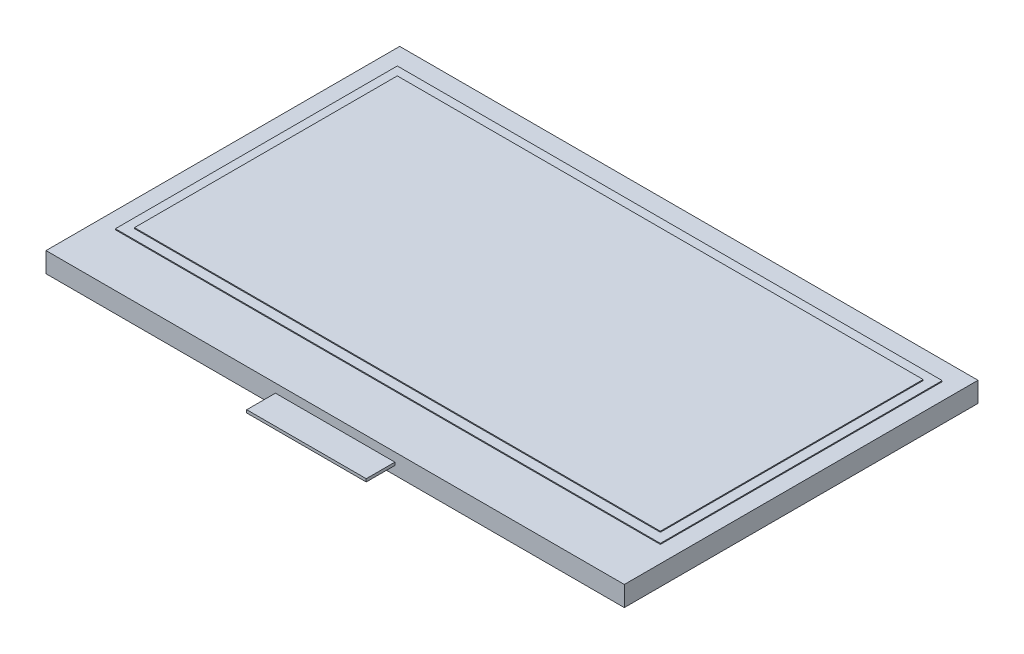
ISO-10303-21;
HEADER;
FILE_DESCRIPTION(('STEP AP214'),'2;1');
FILE_NAME('part.step','',(''),(''),'','','');
FILE_SCHEMA(('AUTOMOTIVE_DESIGN { 1 0 10303 214 1 1 1 1 }'));
ENDSEC;
DATA;
#1=APPLICATION_CONTEXT('core data for automotive mechanical design processes');
#2=APPLICATION_PROTOCOL_DEFINITION('international standard','automotive_design',2000,#1);
#3=PRODUCT_CONTEXT('',#1,'mechanical');
#4=PRODUCT('Part','Part','',(#3));
#5=PRODUCT_RELATED_PRODUCT_CATEGORY('part','',(#4));
#6=PRODUCT_DEFINITION_FORMATION('','',#4);
#7=PRODUCT_DEFINITION_CONTEXT('part definition',#1,'design');
#8=PRODUCT_DEFINITION('design','',#6,#7);
#9=PRODUCT_DEFINITION_SHAPE('','',#8);
#10=(LENGTH_UNIT() NAMED_UNIT(*) SI_UNIT(.MILLI.,.METRE.));
#11=(NAMED_UNIT(*) PLANE_ANGLE_UNIT() SI_UNIT($,.RADIAN.));
#12=(NAMED_UNIT(*) SI_UNIT($,.STERADIAN.) SOLID_ANGLE_UNIT());
#13=UNCERTAINTY_MEASURE_WITH_UNIT(LENGTH_MEASURE(1.E-05),#10,'distance_accuracy_value','');
#14=(GEOMETRIC_REPRESENTATION_CONTEXT(3) GLOBAL_UNCERTAINTY_ASSIGNED_CONTEXT((#13)) GLOBAL_UNIT_ASSIGNED_CONTEXT((#10,
#11,#12)) REPRESENTATION_CONTEXT('',''));
#15=CARTESIAN_POINT('',(0.,0.,0.));
#16=DIRECTION('',(0.,0.,1.));
#17=DIRECTION('',(1.,0.,0.));
#18=AXIS2_PLACEMENT_3D('',#15,#16,#17);
#19=CARTESIAN_POINT('',(30.25,2.1,18.5));
#20=DIRECTION('',(0.,0.,-1.));
#21=DIRECTION('',(-1.,0.,0.));
#22=AXIS2_PLACEMENT_3D('',#19,#20,#21);
#23=PLANE('',#22);
#24=DIRECTION('',(1.,0.,0.));
#25=VECTOR('',#24,1.);
#26=CARTESIAN_POINT('',(30.25,0.,18.5));
#27=LINE('',#26,#25);
#28=CARTESIAN_POINT('',(-30.25,0.,18.5));
#29=VERTEX_POINT('',#28);
#30=CARTESIAN_POINT('',(30.25,0.,18.5));
#31=VERTEX_POINT('',#30);
#32=EDGE_CURVE('E246',#29,#31,#27,.T.);
#33=ORIENTED_EDGE('',*,*,#32,.T.);
#34=DIRECTION('',(0.,-1.,0.));
#35=VECTOR('',#34,1.);
#36=CARTESIAN_POINT('',(30.25,2.1,18.5));
#37=LINE('',#36,#35);
#38=CARTESIAN_POINT('',(30.25,2.1,18.5));
#39=VERTEX_POINT('',#38);
#40=EDGE_CURVE('E43',#39,#31,#37,.T.);
#41=ORIENTED_EDGE('',*,*,#40,.F.);
#42=DIRECTION('',(1.,0.,0.));
#43=VECTOR('',#42,1.);
#44=CARTESIAN_POINT('',(30.25,2.1,18.5));
#45=LINE('',#44,#43);
#46=CARTESIAN_POINT('',(-30.25,2.1,18.5));
#47=VERTEX_POINT('',#46);
#48=EDGE_CURVE('E236',#47,#39,#45,.T.);
#49=ORIENTED_EDGE('',*,*,#48,.F.);
#50=DIRECTION('',(0.,-1.,0.));
#51=VECTOR('',#50,1.);
#52=CARTESIAN_POINT('',(-30.25,2.1,18.5));
#53=LINE('',#52,#51);
#54=EDGE_CURVE('E11',#47,#29,#53,.T.);
#55=ORIENTED_EDGE('',*,*,#54,.T.);
#56=EDGE_LOOP('',(#33,#41,#49,#55));
#57=FACE_BOUND('',#56,.T.);
#58=DIRECTION('',(0.,-1.,0.));
#59=VECTOR('',#58,1.);
#60=CARTESIAN_POINT('',(-6.25000000000002,1.18186060075837,18.5));
#61=LINE('',#60,#59);
#62=CARTESIAN_POINT('',(-6.25000000000002,1.18186060075837,18.5));
#63=VERTEX_POINT('',#62);
#64=CARTESIAN_POINT('',(-6.25000000000002,0.881860600758366,18.5));
#65=VERTEX_POINT('',#64);
#66=EDGE_CURVE('E168',#63,#65,#61,.T.);
#67=ORIENTED_EDGE('',*,*,#66,.F.);
#68=DIRECTION('',(-1.,0.,0.));
#69=VECTOR('',#68,1.);
#70=CARTESIAN_POINT('',(-6.25000000000002,1.18186060075837,18.5));
#71=LINE('',#70,#69);
#72=CARTESIAN_POINT('',(6.24999999999998,1.18186060075837,18.5));
#73=VERTEX_POINT('',#72);
#74=EDGE_CURVE('E165',#73,#63,#71,.T.);
#75=ORIENTED_EDGE('',*,*,#74,.F.);
#76=DIRECTION('',(0.,1.,0.));
#77=VECTOR('',#76,1.);
#78=CARTESIAN_POINT('',(6.24999999999998,1.18186060075837,18.5));
#79=LINE('',#78,#77);
#80=CARTESIAN_POINT('',(6.24999999999998,0.881860600758365,18.5));
#81=VERTEX_POINT('',#80);
#82=EDGE_CURVE('E55',#81,#73,#79,.T.);
#83=ORIENTED_EDGE('',*,*,#82,.F.);
#84=DIRECTION('',(1.,0.,0.));
#85=VECTOR('',#84,1.);
#86=CARTESIAN_POINT('',(-6.25000000000002,0.881860600758366,18.5));
#87=LINE('',#86,#85);
#88=EDGE_CURVE('E50',#65,#81,#87,.T.);
#89=ORIENTED_EDGE('',*,*,#88,.F.);
#90=EDGE_LOOP('',(#67,#75,#83,#89));
#91=FACE_BOUND('',#90,.T.);
#92=ADVANCED_FACE('F35',(#57,#91),#23,.F.);
#93=CARTESIAN_POINT('',(0.,2.2,0.));
#94=DIRECTION('',(0.,1.,0.));
#95=DIRECTION('',(0.,0.,1.));
#96=AXIS2_PLACEMENT_3D('',#93,#94,#95);
#97=PLANE('',#96);
#98=DIRECTION('',(0.,0.,1.));
#99=VECTOR('',#98,1.);
#100=CARTESIAN_POINT('',(-28.5,2.2,-16.5));
#101=LINE('',#100,#99);
#102=CARTESIAN_POINT('',(-28.5,2.2,-16.5));
#103=VERTEX_POINT('',#102);
#104=CARTESIAN_POINT('',(-28.5,2.2,12.99));
#105=VERTEX_POINT('',#104);
#106=EDGE_CURVE('E204',#103,#105,#101,.T.);
#107=ORIENTED_EDGE('',*,*,#106,.T.);
#108=DIRECTION('',(1.,0.,0.));
#109=VECTOR('',#108,1.);
#110=CARTESIAN_POINT('',(-28.5,2.2,12.99));
#111=LINE('',#110,#109);
#112=CARTESIAN_POINT('',(28.51,2.2,12.99));
#113=VERTEX_POINT('',#112);
#114=EDGE_CURVE('E207',#105,#113,#111,.T.);
#115=ORIENTED_EDGE('',*,*,#114,.T.);
#116=DIRECTION('',(0.,0.,-1.));
#117=VECTOR('',#116,1.);
#118=CARTESIAN_POINT('',(28.51,2.2,-16.5));
#119=LINE('',#118,#117);
#120=CARTESIAN_POINT('',(28.51,2.2,-16.5));
#121=VERTEX_POINT('',#120);
#122=EDGE_CURVE('E210',#113,#121,#119,.T.);
#123=ORIENTED_EDGE('',*,*,#122,.T.);
#124=DIRECTION('',(-1.,0.,0.));
#125=VECTOR('',#124,1.);
#126=CARTESIAN_POINT('',(-28.5,2.2,-16.5));
#127=LINE('',#126,#125);
#128=EDGE_CURVE('E212',#121,#103,#127,.T.);
#129=ORIENTED_EDGE('',*,*,#128,.T.);
#130=EDGE_LOOP('',(#107,#115,#123,#129));
#131=FACE_BOUND('',#130,.T.);
#132=DIRECTION('',(1.,0.,0.));
#133=VECTOR('',#132,1.);
#134=CARTESIAN_POINT('',(-27.5,2.2,11.99));
#135=LINE('',#134,#133);
#136=CARTESIAN_POINT('',(-27.5,2.2,11.99));
#137=VERTEX_POINT('',#136);
#138=CARTESIAN_POINT('',(27.51,2.2,11.99));
#139=VERTEX_POINT('',#138);
#140=EDGE_CURVE('E172',#137,#139,#135,.T.);
#141=ORIENTED_EDGE('',*,*,#140,.F.);
#142=DIRECTION('',(0.,0.,1.));
#143=VECTOR('',#142,1.);
#144=CARTESIAN_POINT('',(-27.5,2.2,-15.5));
#145=LINE('',#144,#143);
#146=CARTESIAN_POINT('',(-27.5,2.2,-15.5));
#147=VERTEX_POINT('',#146);
#148=EDGE_CURVE('E169',#147,#137,#145,.T.);
#149=ORIENTED_EDGE('',*,*,#148,.F.);
#150=DIRECTION('',(-1.,0.,0.));
#151=VECTOR('',#150,1.);
#152=CARTESIAN_POINT('',(27.51,2.2,-15.5));
#153=LINE('',#152,#151);
#154=CARTESIAN_POINT('',(27.51,2.2,-15.5));
#155=VERTEX_POINT('',#154);
#156=EDGE_CURVE('E182',#155,#147,#153,.T.);
#157=ORIENTED_EDGE('',*,*,#156,.F.);
#158=DIRECTION('',(0.,0.,-1.));
#159=VECTOR('',#158,1.);
#160=CARTESIAN_POINT('',(27.51,2.2,11.99));
#161=LINE('',#160,#159);
#162=EDGE_CURVE('E190',#139,#155,#161,.T.);
#163=ORIENTED_EDGE('',*,*,#162,.F.);
#164=EDGE_LOOP('',(#141,#149,#157,#163));
#165=FACE_BOUND('',#164,.T.);
#166=ADVANCED_FACE('F278',(#131,#165),#97,.T.);
#167=CARTESIAN_POINT('',(0.,2.1,0.));
#168=DIRECTION('',(0.,1.,0.));
#169=DIRECTION('',(0.,0.,1.));
#170=AXIS2_PLACEMENT_3D('',#167,#168,#169);
#171=PLANE('',#170);
#172=DIRECTION('',(0.,0.,1.));
#173=VECTOR('',#172,1.);
#174=CARTESIAN_POINT('',(-30.25,2.1,18.5));
#175=LINE('',#174,#173);
#176=CARTESIAN_POINT('',(-30.25,2.1,-18.5));
#177=VERTEX_POINT('',#176);
#178=EDGE_CURVE('E233',#177,#47,#175,.T.);
#179=ORIENTED_EDGE('',*,*,#178,.T.);
#180=ORIENTED_EDGE('',*,*,#48,.T.);
#181=DIRECTION('',(0.,0.,-1.));
#182=VECTOR('',#181,1.);
#183=CARTESIAN_POINT('',(30.25,2.1,18.5));
#184=LINE('',#183,#182);
#185=CARTESIAN_POINT('',(30.25,2.1,-18.5));
#186=VERTEX_POINT('',#185);
#187=EDGE_CURVE('E239',#39,#186,#184,.T.);
#188=ORIENTED_EDGE('',*,*,#187,.T.);
#189=DIRECTION('',(-1.,0.,0.));
#190=VECTOR('',#189,1.);
#191=CARTESIAN_POINT('',(30.25,2.1,-18.5));
#192=LINE('',#191,#190);
#193=EDGE_CURVE('E241',#186,#177,#192,.T.);
#194=ORIENTED_EDGE('',*,*,#193,.T.);
#195=EDGE_LOOP('',(#179,#180,#188,#194));
#196=FACE_BOUND('',#195,.T.);
#197=DIRECTION('',(1.,0.,0.));
#198=VECTOR('',#197,1.);
#199=CARTESIAN_POINT('',(-28.5,2.1,12.99));
#200=LINE('',#199,#198);
#201=CARTESIAN_POINT('',(-28.5,2.1,12.99));
#202=VERTEX_POINT('',#201);
#203=CARTESIAN_POINT('',(28.51,2.1,12.99));
#204=VERTEX_POINT('',#203);
#205=EDGE_CURVE('E217',#202,#204,#200,.T.);
#206=ORIENTED_EDGE('',*,*,#205,.F.);
#207=DIRECTION('',(0.,0.,1.));
#208=VECTOR('',#207,1.);
#209=CARTESIAN_POINT('',(-28.5,2.1,-16.5));
#210=LINE('',#209,#208);
#211=CARTESIAN_POINT('',(-28.5,2.1,-16.5));
#212=VERTEX_POINT('',#211);
#213=EDGE_CURVE('E203',#212,#202,#210,.T.);
#214=ORIENTED_EDGE('',*,*,#213,.F.);
#215=DIRECTION('',(-1.,0.,0.));
#216=VECTOR('',#215,1.);
#217=CARTESIAN_POINT('',(-28.5,2.1,-16.5));
#218=LINE('',#217,#216);
#219=CARTESIAN_POINT('',(28.51,2.1,-16.5));
#220=VERTEX_POINT('',#219);
#221=EDGE_CURVE('E208',#220,#212,#218,.T.);
#222=ORIENTED_EDGE('',*,*,#221,.F.);
#223=DIRECTION('',(0.,0.,-1.));
#224=VECTOR('',#223,1.);
#225=CARTESIAN_POINT('',(28.51,2.1,-16.5));
#226=LINE('',#225,#224);
#227=EDGE_CURVE('E219',#204,#220,#226,.T.);
#228=ORIENTED_EDGE('',*,*,#227,.F.);
#229=EDGE_LOOP('',(#206,#214,#222,#228));
#230=FACE_BOUND('',#229,.T.);
#231=ADVANCED_FACE('F275',(#196,#230),#171,.T.);
#232=CARTESIAN_POINT('',(-30.25,2.1,18.5));
#233=DIRECTION('',(1.,0.,0.));
#234=DIRECTION('',(0.,0.,-1.));
#235=AXIS2_PLACEMENT_3D('',#232,#233,#234);
#236=PLANE('',#235);
#237=DIRECTION('',(0.,0.,1.));
#238=VECTOR('',#237,1.);
#239=CARTESIAN_POINT('',(-30.25,0.,18.5));
#240=LINE('',#239,#238);
#241=CARTESIAN_POINT('',(-30.25,0.,-18.5));
#242=VERTEX_POINT('',#241);
#243=EDGE_CURVE('E232',#242,#29,#240,.T.);
#244=ORIENTED_EDGE('',*,*,#243,.T.);
#245=ORIENTED_EDGE('',*,*,#54,.F.);
#246=ORIENTED_EDGE('',*,*,#178,.F.);
#247=DIRECTION('',(0.,-1.,0.));
#248=VECTOR('',#247,1.);
#249=CARTESIAN_POINT('',(-30.25,2.1,-18.5));
#250=LINE('',#249,#248);
#251=EDGE_CURVE('E243',#177,#242,#250,.T.);
#252=ORIENTED_EDGE('',*,*,#251,.T.);
#253=EDGE_LOOP('',(#244,#245,#246,#252));
#254=FACE_BOUND('',#253,.T.);
#255=ADVANCED_FACE('F37',(#254),#236,.F.);
#256=CARTESIAN_POINT('',(30.25,2.1,18.5));
#257=DIRECTION('',(-1.,0.,0.));
#258=DIRECTION('',(0.,0.,1.));
#259=AXIS2_PLACEMENT_3D('',#256,#257,#258);
#260=PLANE('',#259);
#261=DIRECTION('',(0.,0.,-1.));
#262=VECTOR('',#261,1.);
#263=CARTESIAN_POINT('',(30.25,0.,18.5));
#264=LINE('',#263,#262);
#265=CARTESIAN_POINT('',(30.25,0.,-18.5));
#266=VERTEX_POINT('',#265);
#267=EDGE_CURVE('E248',#31,#266,#264,.T.);
#268=ORIENTED_EDGE('',*,*,#267,.T.);
#269=DIRECTION('',(0.,-1.,0.));
#270=VECTOR('',#269,1.);
#271=CARTESIAN_POINT('',(30.25,2.1,-18.5));
#272=LINE('',#271,#270);
#273=EDGE_CURVE('E253',#186,#266,#272,.T.);
#274=ORIENTED_EDGE('',*,*,#273,.F.);
#275=ORIENTED_EDGE('',*,*,#187,.F.);
#276=ORIENTED_EDGE('',*,*,#40,.T.);
#277=EDGE_LOOP('',(#268,#274,#275,#276));
#278=FACE_BOUND('',#277,.T.);
#279=ADVANCED_FACE('F260',(#278),#260,.F.);
#280=CARTESIAN_POINT('',(30.25,2.1,-18.5));
#281=DIRECTION('',(0.,0.,1.));
#282=DIRECTION('',(1.,0.,0.));
#283=AXIS2_PLACEMENT_3D('',#280,#281,#282);
#284=PLANE('',#283);
#285=DIRECTION('',(-1.,0.,0.));
#286=VECTOR('',#285,1.);
#287=CARTESIAN_POINT('',(30.25,0.,-18.5));
#288=LINE('',#287,#286);
#289=EDGE_CURVE('E237',#266,#242,#288,.T.);
#290=ORIENTED_EDGE('',*,*,#289,.T.);
#291=ORIENTED_EDGE('',*,*,#251,.F.);
#292=ORIENTED_EDGE('',*,*,#193,.F.);
#293=ORIENTED_EDGE('',*,*,#273,.T.);
#294=EDGE_LOOP('',(#290,#291,#292,#293));
#295=FACE_BOUND('',#294,.T.);
#296=ADVANCED_FACE('F269',(#295),#284,.F.);
#297=CARTESIAN_POINT('',(0.,0.,0.));
#298=DIRECTION('',(0.,1.,0.));
#299=DIRECTION('',(0.,0.,1.));
#300=AXIS2_PLACEMENT_3D('',#297,#298,#299);
#301=PLANE('',#300);
#302=ORIENTED_EDGE('',*,*,#243,.F.);
#303=ORIENTED_EDGE('',*,*,#289,.F.);
#304=ORIENTED_EDGE('',*,*,#267,.F.);
#305=ORIENTED_EDGE('',*,*,#32,.F.);
#306=EDGE_LOOP('',(#302,#303,#304,#305));
#307=FACE_BOUND('',#306,.T.);
#308=ADVANCED_FACE('F266',(#307),#301,.F.);
#309=CARTESIAN_POINT('',(-28.5,2.2,-16.5));
#310=DIRECTION('',(1.,0.,0.));
#311=DIRECTION('',(0.,0.,-1.));
#312=AXIS2_PLACEMENT_3D('',#309,#310,#311);
#313=PLANE('',#312);
#314=ORIENTED_EDGE('',*,*,#213,.T.);
#315=DIRECTION('',(0.,-1.,0.));
#316=VECTOR('',#315,1.);
#317=CARTESIAN_POINT('',(-28.5,2.2,12.99));
#318=LINE('',#317,#316);
#319=EDGE_CURVE('E230',#105,#202,#318,.T.);
#320=ORIENTED_EDGE('',*,*,#319,.F.);
#321=ORIENTED_EDGE('',*,*,#106,.F.);
#322=DIRECTION('',(0.,-1.,0.));
#323=VECTOR('',#322,1.);
#324=CARTESIAN_POINT('',(-28.5,2.2,-16.5));
#325=LINE('',#324,#323);
#326=EDGE_CURVE('E214',#103,#212,#325,.T.);
#327=ORIENTED_EDGE('',*,*,#326,.T.);
#328=EDGE_LOOP('',(#314,#320,#321,#327));
#329=FACE_BOUND('',#328,.T.);
#330=ADVANCED_FACE('F340',(#329),#313,.F.);
#331=CARTESIAN_POINT('',(-28.5,2.2,12.99));
#332=DIRECTION('',(0.,0.,-1.));
#333=DIRECTION('',(-1.,0.,0.));
#334=AXIS2_PLACEMENT_3D('',#331,#332,#333);
#335=PLANE('',#334);
#336=ORIENTED_EDGE('',*,*,#205,.T.);
#337=DIRECTION('',(0.,-1.,0.));
#338=VECTOR('',#337,1.);
#339=CARTESIAN_POINT('',(28.51,2.2,12.99));
#340=LINE('',#339,#338);
#341=EDGE_CURVE('E227',#113,#204,#340,.T.);
#342=ORIENTED_EDGE('',*,*,#341,.F.);
#343=ORIENTED_EDGE('',*,*,#114,.F.);
#344=ORIENTED_EDGE('',*,*,#319,.T.);
#345=EDGE_LOOP('',(#336,#342,#343,#344));
#346=FACE_BOUND('',#345,.T.);
#347=ADVANCED_FACE('F336',(#346),#335,.F.);
#348=CARTESIAN_POINT('',(28.51,2.2,-16.5));
#349=DIRECTION('',(-1.,0.,0.));
#350=DIRECTION('',(0.,0.,1.));
#351=AXIS2_PLACEMENT_3D('',#348,#349,#350);
#352=PLANE('',#351);
#353=ORIENTED_EDGE('',*,*,#227,.T.);
#354=DIRECTION('',(0.,-1.,0.));
#355=VECTOR('',#354,1.);
#356=CARTESIAN_POINT('',(28.51,2.2,-16.5));
#357=LINE('',#356,#355);
#358=EDGE_CURVE('E225',#121,#220,#357,.T.);
#359=ORIENTED_EDGE('',*,*,#358,.F.);
#360=ORIENTED_EDGE('',*,*,#122,.F.);
#361=ORIENTED_EDGE('',*,*,#341,.T.);
#362=EDGE_LOOP('',(#353,#359,#360,#361));
#363=FACE_BOUND('',#362,.T.);
#364=ADVANCED_FACE('F332',(#363),#352,.F.);
#365=CARTESIAN_POINT('',(-28.5,2.2,-16.5));
#366=DIRECTION('',(0.,0.,1.));
#367=DIRECTION('',(1.,0.,0.));
#368=AXIS2_PLACEMENT_3D('',#365,#366,#367);
#369=PLANE('',#368);
#370=ORIENTED_EDGE('',*,*,#221,.T.);
#371=ORIENTED_EDGE('',*,*,#326,.F.);
#372=ORIENTED_EDGE('',*,*,#128,.F.);
#373=ORIENTED_EDGE('',*,*,#358,.T.);
#374=EDGE_LOOP('',(#370,#371,#372,#373));
#375=FACE_BOUND('',#374,.T.);
#376=ADVANCED_FACE('F325',(#375),#369,.F.);
#377=CARTESIAN_POINT('',(-27.5,2.3,-15.5));
#378=DIRECTION('',(1.,0.,0.));
#379=DIRECTION('',(0.,0.,-1.));
#380=AXIS2_PLACEMENT_3D('',#377,#378,#379);
#381=PLANE('',#380);
#382=ORIENTED_EDGE('',*,*,#148,.T.);
#383=DIRECTION('',(0.,-1.,0.));
#384=VECTOR('',#383,1.);
#385=CARTESIAN_POINT('',(-27.5,2.3,11.99));
#386=LINE('',#385,#384);
#387=CARTESIAN_POINT('',(-27.5,2.3,11.99));
#388=VERTEX_POINT('',#387);
#389=EDGE_CURVE('E201',#388,#137,#386,.T.);
#390=ORIENTED_EDGE('',*,*,#389,.F.);
#391=DIRECTION('',(0.,0.,1.));
#392=VECTOR('',#391,1.);
#393=CARTESIAN_POINT('',(-27.5,2.3,-15.5));
#394=LINE('',#393,#392);
#395=CARTESIAN_POINT('',(-27.5,2.3,-15.5));
#396=VERTEX_POINT('',#395);
#397=EDGE_CURVE('E178',#396,#388,#394,.T.);
#398=ORIENTED_EDGE('',*,*,#397,.F.);
#399=DIRECTION('',(0.,-1.,0.));
#400=VECTOR('',#399,1.);
#401=CARTESIAN_POINT('',(-27.5,2.3,-15.5));
#402=LINE('',#401,#400);
#403=EDGE_CURVE('E187',#396,#147,#402,.T.);
#404=ORIENTED_EDGE('',*,*,#403,.T.);
#405=EDGE_LOOP('',(#382,#390,#398,#404));
#406=FACE_BOUND('',#405,.T.);
#407=ADVANCED_FACE('F321',(#406),#381,.F.);
#408=CARTESIAN_POINT('',(-27.5,2.3,11.99));
#409=DIRECTION('',(0.,0.,-1.));
#410=DIRECTION('',(-1.,0.,0.));
#411=AXIS2_PLACEMENT_3D('',#408,#409,#410);
#412=PLANE('',#411);
#413=ORIENTED_EDGE('',*,*,#140,.T.);
#414=DIRECTION('',(0.,-1.,0.));
#415=VECTOR('',#414,1.);
#416=CARTESIAN_POINT('',(27.51,2.3,11.99));
#417=LINE('',#416,#415);
#418=CARTESIAN_POINT('',(27.51,2.3,11.99));
#419=VERTEX_POINT('',#418);
#420=EDGE_CURVE('E198',#419,#139,#417,.T.);
#421=ORIENTED_EDGE('',*,*,#420,.F.);
#422=DIRECTION('',(1.,0.,0.));
#423=VECTOR('',#422,1.);
#424=CARTESIAN_POINT('',(-27.5,2.3,11.99));
#425=LINE('',#424,#423);
#426=EDGE_CURVE('E181',#388,#419,#425,.T.);
#427=ORIENTED_EDGE('',*,*,#426,.F.);
#428=ORIENTED_EDGE('',*,*,#389,.T.);
#429=EDGE_LOOP('',(#413,#421,#427,#428));
#430=FACE_BOUND('',#429,.T.);
#431=ADVANCED_FACE('F317',(#430),#412,.F.);
#432=CARTESIAN_POINT('',(27.51,2.3,11.99));
#433=DIRECTION('',(-1.,0.,0.));
#434=DIRECTION('',(0.,0.,1.));
#435=AXIS2_PLACEMENT_3D('',#432,#433,#434);
#436=PLANE('',#435);
#437=ORIENTED_EDGE('',*,*,#162,.T.);
#438=DIRECTION('',(0.,-1.,0.));
#439=VECTOR('',#438,1.);
#440=CARTESIAN_POINT('',(27.51,2.3,-15.5));
#441=LINE('',#440,#439);
#442=CARTESIAN_POINT('',(27.51,2.3,-15.5));
#443=VERTEX_POINT('',#442);
#444=EDGE_CURVE('E196',#443,#155,#441,.T.);
#445=ORIENTED_EDGE('',*,*,#444,.F.);
#446=DIRECTION('',(0.,0.,-1.));
#447=VECTOR('',#446,1.);
#448=CARTESIAN_POINT('',(27.51,2.3,11.99));
#449=LINE('',#448,#447);
#450=EDGE_CURVE('E184',#419,#443,#449,.T.);
#451=ORIENTED_EDGE('',*,*,#450,.F.);
#452=ORIENTED_EDGE('',*,*,#420,.T.);
#453=EDGE_LOOP('',(#437,#445,#451,#452));
#454=FACE_BOUND('',#453,.T.);
#455=ADVANCED_FACE('F313',(#454),#436,.F.);
#456=CARTESIAN_POINT('',(27.51,2.3,-15.5));
#457=DIRECTION('',(0.,0.,1.));
#458=DIRECTION('',(1.,0.,0.));
#459=AXIS2_PLACEMENT_3D('',#456,#457,#458);
#460=PLANE('',#459);
#461=ORIENTED_EDGE('',*,*,#156,.T.);
#462=ORIENTED_EDGE('',*,*,#403,.F.);
#463=DIRECTION('',(-1.,0.,0.));
#464=VECTOR('',#463,1.);
#465=CARTESIAN_POINT('',(27.51,2.3,-15.5));
#466=LINE('',#465,#464);
#467=EDGE_CURVE('E186',#443,#396,#466,.T.);
#468=ORIENTED_EDGE('',*,*,#467,.F.);
#469=ORIENTED_EDGE('',*,*,#444,.T.);
#470=EDGE_LOOP('',(#461,#462,#468,#469));
#471=FACE_BOUND('',#470,.T.);
#472=ADVANCED_FACE('F309',(#471),#460,.F.);
#473=CARTESIAN_POINT('',(0.,2.3,0.));
#474=DIRECTION('',(0.,1.,0.));
#475=DIRECTION('',(0.,0.,1.));
#476=AXIS2_PLACEMENT_3D('',#473,#474,#475);
#477=PLANE('',#476);
#478=ORIENTED_EDGE('',*,*,#397,.T.);
#479=ORIENTED_EDGE('',*,*,#426,.T.);
#480=ORIENTED_EDGE('',*,*,#450,.T.);
#481=ORIENTED_EDGE('',*,*,#467,.T.);
#482=EDGE_LOOP('',(#478,#479,#480,#481));
#483=FACE_BOUND('',#482,.T.);
#484=ADVANCED_FACE('F306',(#483),#477,.T.);
#485=CARTESIAN_POINT('',(-6.25000000000002,1.18186060075837,21.5));
#486=DIRECTION('',(1.,0.,0.));
#487=DIRECTION('',(0.,0.,-1.));
#488=AXIS2_PLACEMENT_3D('',#485,#486,#487);
#489=PLANE('',#488);
#490=ORIENTED_EDGE('',*,*,#66,.T.);
#491=DIRECTION('',(0.,0.,-1.));
#492=VECTOR('',#491,1.);
#493=CARTESIAN_POINT('',(-6.25000000000002,0.881860600758366,21.5));
#494=LINE('',#493,#492);
#495=CARTESIAN_POINT('',(-6.25000000000002,0.881860600758366,21.5));
#496=VERTEX_POINT('',#495);
#497=EDGE_CURVE('E149',#496,#65,#494,.T.);
#498=ORIENTED_EDGE('',*,*,#497,.F.);
#499=DIRECTION('',(0.,-1.,0.));
#500=VECTOR('',#499,1.);
#501=CARTESIAN_POINT('',(-6.25000000000002,1.18186060075837,21.5));
#502=LINE('',#501,#500);
#503=CARTESIAN_POINT('',(-6.25000000000002,1.18186060075837,21.5));
#504=VERTEX_POINT('',#503);
#505=EDGE_CURVE('E156',#504,#496,#502,.T.);
#506=ORIENTED_EDGE('',*,*,#505,.F.);
#507=DIRECTION('',(0.,0.,-1.));
#508=VECTOR('',#507,1.);
#509=CARTESIAN_POINT('',(-6.25000000000002,1.18186060075837,21.5));
#510=LINE('',#509,#508);
#511=EDGE_CURVE('E284',#504,#63,#510,.T.);
#512=ORIENTED_EDGE('',*,*,#511,.T.);
#513=EDGE_LOOP('',(#490,#498,#506,#512));
#514=FACE_BOUND('',#513,.T.);
#515=ADVANCED_FACE('F167',(#514),#489,.F.);
#516=CARTESIAN_POINT('',(-6.25000000000002,0.881860600758366,21.5));
#517=DIRECTION('',(0.,1.,0.));
#518=DIRECTION('',(0.,0.,1.));
#519=AXIS2_PLACEMENT_3D('',#516,#517,#518);
#520=PLANE('',#519);
#521=ORIENTED_EDGE('',*,*,#88,.T.);
#522=DIRECTION('',(0.,0.,-1.));
#523=VECTOR('',#522,1.);
#524=CARTESIAN_POINT('',(6.24999999999998,0.881860600758366,21.5));
#525=LINE('',#524,#523);
#526=CARTESIAN_POINT('',(6.24999999999998,0.881860600758366,21.5));
#527=VERTEX_POINT('',#526);
#528=EDGE_CURVE('E152',#527,#81,#525,.T.);
#529=ORIENTED_EDGE('',*,*,#528,.F.);
#530=DIRECTION('',(1.,0.,0.));
#531=VECTOR('',#530,1.);
#532=CARTESIAN_POINT('',(-6.25000000000002,0.881860600758366,21.5));
#533=LINE('',#532,#531);
#534=EDGE_CURVE('E145',#496,#527,#533,.T.);
#535=ORIENTED_EDGE('',*,*,#534,.F.);
#536=ORIENTED_EDGE('',*,*,#497,.T.);
#537=EDGE_LOOP('',(#521,#529,#535,#536));
#538=FACE_BOUND('',#537,.T.);
#539=ADVANCED_FACE('F147',(#538),#520,.F.);
#540=CARTESIAN_POINT('',(6.24999999999998,1.18186060075837,21.5));
#541=DIRECTION('',(-1.,0.,0.));
#542=DIRECTION('',(0.,-1.,0.));
#543=AXIS2_PLACEMENT_3D('',#540,#541,#542);
#544=PLANE('',#543);
#545=ORIENTED_EDGE('',*,*,#82,.T.);
#546=DIRECTION('',(0.,0.,-1.));
#547=VECTOR('',#546,1.);
#548=CARTESIAN_POINT('',(6.24999999999998,1.18186060075837,21.5));
#549=LINE('',#548,#547);
#550=CARTESIAN_POINT('',(6.24999999999998,1.18186060075837,21.5));
#551=VERTEX_POINT('',#550);
#552=EDGE_CURVE('E174',#551,#73,#549,.T.);
#553=ORIENTED_EDGE('',*,*,#552,.F.);
#554=DIRECTION('',(0.,1.,0.));
#555=VECTOR('',#554,1.);
#556=CARTESIAN_POINT('',(6.24999999999998,1.18186060075837,21.5));
#557=LINE('',#556,#555);
#558=EDGE_CURVE('E155',#527,#551,#557,.T.);
#559=ORIENTED_EDGE('',*,*,#558,.F.);
#560=ORIENTED_EDGE('',*,*,#528,.T.);
#561=EDGE_LOOP('',(#545,#553,#559,#560));
#562=FACE_BOUND('',#561,.T.);
#563=ADVANCED_FACE('F293',(#562),#544,.F.);
#564=CARTESIAN_POINT('',(-6.25000000000002,1.18186060075837,21.5));
#565=DIRECTION('',(0.,-1.,0.));
#566=DIRECTION('',(0.,0.,-1.));
#567=AXIS2_PLACEMENT_3D('',#564,#565,#566);
#568=PLANE('',#567);
#569=ORIENTED_EDGE('',*,*,#74,.T.);
#570=ORIENTED_EDGE('',*,*,#511,.F.);
#571=DIRECTION('',(-1.,0.,0.));
#572=VECTOR('',#571,1.);
#573=CARTESIAN_POINT('',(-6.25000000000002,1.18186060075837,21.5));
#574=LINE('',#573,#572);
#575=EDGE_CURVE('E161',#551,#504,#574,.T.);
#576=ORIENTED_EDGE('',*,*,#575,.F.);
#577=ORIENTED_EDGE('',*,*,#552,.T.);
#578=EDGE_LOOP('',(#569,#570,#576,#577));
#579=FACE_BOUND('',#578,.T.);
#580=ADVANCED_FACE('F283',(#579),#568,.F.);
#581=CARTESIAN_POINT('',(0.,0.,21.5));
#582=DIRECTION('',(0.,0.,1.));
#583=DIRECTION('',(1.,0.,0.));
#584=AXIS2_PLACEMENT_3D('',#581,#582,#583);
#585=PLANE('',#584);
#586=ORIENTED_EDGE('',*,*,#505,.T.);
#587=ORIENTED_EDGE('',*,*,#534,.T.);
#588=ORIENTED_EDGE('',*,*,#558,.T.);
#589=ORIENTED_EDGE('',*,*,#575,.T.);
#590=EDGE_LOOP('',(#586,#587,#588,#589));
#591=FACE_BOUND('',#590,.T.);
#592=ADVANCED_FACE('F159',(#591),#585,.T.);
#593=CLOSED_SHELL('',(#92,#166,#231,#255,#279,#296,#308,#330,#347,#364,#376,#407,#431,#455,#472,
#484,#515,#539,#563,#580,#592));
#594=MANIFOLD_SOLID_BREP('B2',#593);
#595=ADVANCED_BREP_SHAPE_REPRESENTATION('',(#18,#594),#14);
#596=SHAPE_DEFINITION_REPRESENTATION(#9,#595);
ENDSEC;
END-ISO-10303-21;
